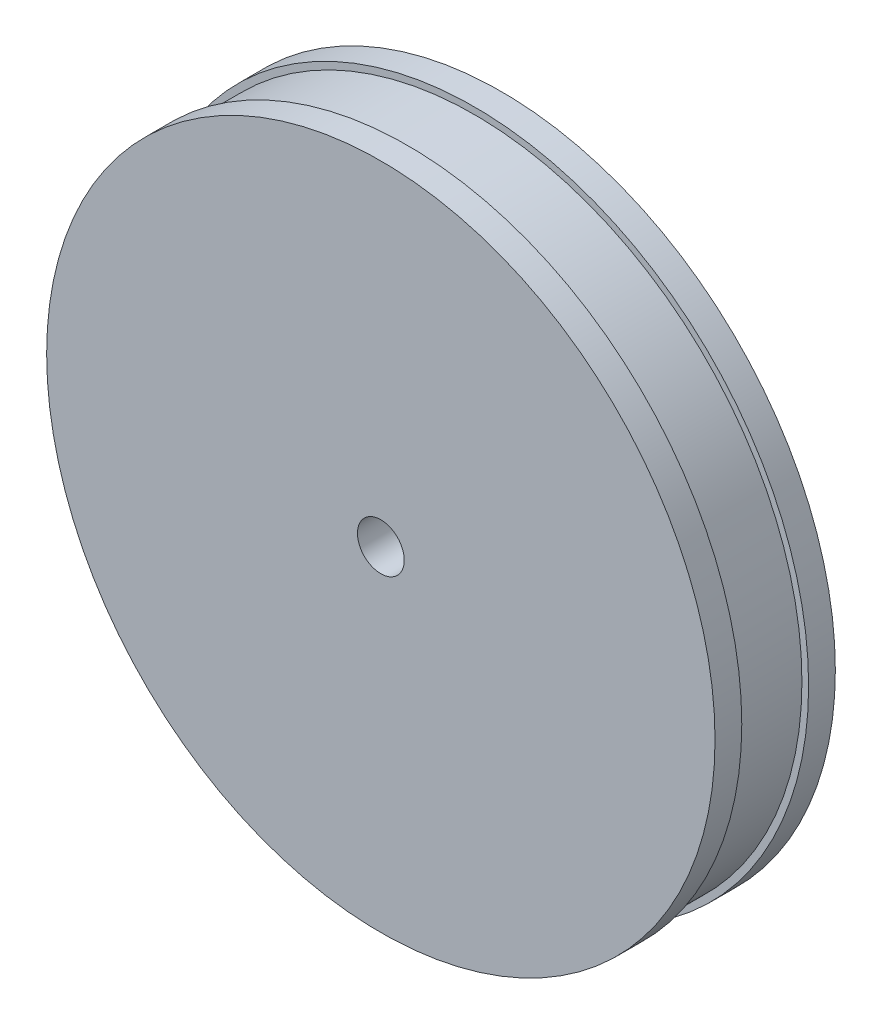
ISO-10303-21;
HEADER;
FILE_DESCRIPTION(('STEP AP214'),'2;1');
FILE_NAME('part.step','',(''),(''),'','','');
FILE_SCHEMA(('AUTOMOTIVE_DESIGN { 1 0 10303 214 1 1 1 1 }'));
ENDSEC;
DATA;
#1=APPLICATION_CONTEXT('core data for automotive mechanical design processes');
#2=APPLICATION_PROTOCOL_DEFINITION('international standard','automotive_design',2000,#1);
#3=PRODUCT_CONTEXT('',#1,'mechanical');
#4=PRODUCT('Part','Part','',(#3));
#5=PRODUCT_RELATED_PRODUCT_CATEGORY('part','',(#4));
#6=PRODUCT_DEFINITION_FORMATION('','',#4);
#7=PRODUCT_DEFINITION_CONTEXT('part definition',#1,'design');
#8=PRODUCT_DEFINITION('design','',#6,#7);
#9=PRODUCT_DEFINITION_SHAPE('','',#8);
#10=(LENGTH_UNIT() NAMED_UNIT(*) SI_UNIT(.MILLI.,.METRE.));
#11=(NAMED_UNIT(*) PLANE_ANGLE_UNIT() SI_UNIT($,.RADIAN.));
#12=(NAMED_UNIT(*) SI_UNIT($,.STERADIAN.) SOLID_ANGLE_UNIT());
#13=UNCERTAINTY_MEASURE_WITH_UNIT(LENGTH_MEASURE(1.E-05),#10,'distance_accuracy_value','');
#14=(GEOMETRIC_REPRESENTATION_CONTEXT(3) GLOBAL_UNCERTAINTY_ASSIGNED_CONTEXT((#13)) GLOBAL_UNIT_ASSIGNED_CONTEXT((#10,
#11,#12)) REPRESENTATION_CONTEXT('',''));
#15=CARTESIAN_POINT('',(0.,0.,0.));
#16=DIRECTION('',(0.,0.,1.));
#17=DIRECTION('',(1.,0.,0.));
#18=AXIS2_PLACEMENT_3D('',#15,#16,#17);
#19=CARTESIAN_POINT('',(0.,0.,5.));
#20=DIRECTION('',(0.,0.,-1.));
#21=DIRECTION('',(-1.,0.,0.));
#22=AXIS2_PLACEMENT_3D('',#19,#20,#21);
#23=CYLINDRICAL_SURFACE('',#22,24.5);
#24=CARTESIAN_POINT('',(0.,0.,5.));
#25=DIRECTION('',(0.,0.,1.));
#26=DIRECTION('',(1.,0.,0.));
#27=AXIS2_PLACEMENT_3D('',#24,#25,#26);
#28=CIRCLE('',#27,24.5);
#29=CARTESIAN_POINT('',(24.5,0.,5.));
#30=VERTEX_POINT('',#29);
#31=EDGE_CURVE('E10',#30,#30,#28,.T.);
#32=ORIENTED_EDGE('',*,*,#31,.F.);
#33=EDGE_LOOP('',(#32));
#34=FACE_BOUND('',#33,.T.);
#35=CARTESIAN_POINT('',(0.,0.,0.));
#36=DIRECTION('',(0.,0.,1.));
#37=DIRECTION('',(1.,0.,0.));
#38=AXIS2_PLACEMENT_3D('',#35,#36,#37);
#39=CIRCLE('',#38,24.5);
#40=CARTESIAN_POINT('',(24.5,0.,0.));
#41=VERTEX_POINT('',#40);
#42=EDGE_CURVE('E33',#41,#41,#39,.T.);
#43=ORIENTED_EDGE('',*,*,#42,.T.);
#44=EDGE_LOOP('',(#43));
#45=FACE_BOUND('',#44,.T.);
#46=ADVANCED_FACE('F30',(#34,#45),#23,.T.);
#47=CARTESIAN_POINT('',(0.,0.,-2.));
#48=DIRECTION('',(0.,0.,1.));
#49=DIRECTION('',(1.,0.,0.));
#50=AXIS2_PLACEMENT_3D('',#47,#48,#49);
#51=CYLINDRICAL_SURFACE('',#50,25.);
#52=CARTESIAN_POINT('',(0.,0.,-2.));
#53=DIRECTION('',(0.,0.,-1.));
#54=DIRECTION('',(-1.,0.,0.));
#55=AXIS2_PLACEMENT_3D('',#52,#53,#54);
#56=CIRCLE('',#55,25.);
#57=CARTESIAN_POINT('',(-25.,0.,-2.));
#58=VERTEX_POINT('',#57);
#59=EDGE_CURVE('E40',#58,#58,#56,.T.);
#60=ORIENTED_EDGE('',*,*,#59,.F.);
#61=EDGE_LOOP('',(#60));
#62=FACE_BOUND('',#61,.T.);
#63=CARTESIAN_POINT('',(0.,0.,0.));
#64=DIRECTION('',(0.,0.,-1.));
#65=DIRECTION('',(-1.,0.,0.));
#66=AXIS2_PLACEMENT_3D('',#63,#64,#65);
#67=CIRCLE('',#66,25.);
#68=CARTESIAN_POINT('',(-25.,0.,0.));
#69=VERTEX_POINT('',#68);
#70=EDGE_CURVE('E42',#69,#69,#67,.T.);
#71=ORIENTED_EDGE('',*,*,#70,.T.);
#72=EDGE_LOOP('',(#71));
#73=FACE_BOUND('',#72,.T.);
#74=ADVANCED_FACE('F74',(#62,#73),#51,.T.);
#75=CARTESIAN_POINT('',(0.,0.,-2.));
#76=DIRECTION('',(0.,0.,-1.));
#77=DIRECTION('',(-1.,0.,0.));
#78=AXIS2_PLACEMENT_3D('',#75,#76,#77);
#79=PLANE('',#78);
#80=CARTESIAN_POINT('',(0.,0.,-2.));
#81=DIRECTION('',(0.,0.,-1.));
#82=DIRECTION('',(-1.,0.,0.));
#83=AXIS2_PLACEMENT_3D('',#80,#81,#82);
#84=CIRCLE('',#83,1.75);
#85=CARTESIAN_POINT('',(-1.75,0.,-2.));
#86=VERTEX_POINT('',#85);
#87=EDGE_CURVE('E54',#86,#86,#84,.T.);
#88=ORIENTED_EDGE('',*,*,#87,.F.);
#89=EDGE_LOOP('',(#88));
#90=FACE_BOUND('',#89,.T.);
#91=ORIENTED_EDGE('',*,*,#59,.T.);
#92=EDGE_LOOP('',(#91));
#93=FACE_BOUND('',#92,.T.);
#94=ADVANCED_FACE('F70',(#90,#93),#79,.T.);
#95=CARTESIAN_POINT('',(0.,0.,0.));
#96=DIRECTION('',(0.,0.,-1.));
#97=DIRECTION('',(-1.,0.,0.));
#98=AXIS2_PLACEMENT_3D('',#95,#96,#97);
#99=PLANE('',#98);
#100=ORIENTED_EDGE('',*,*,#42,.F.);
#101=EDGE_LOOP('',(#100));
#102=FACE_BOUND('',#101,.T.);
#103=ORIENTED_EDGE('',*,*,#70,.F.);
#104=EDGE_LOOP('',(#103));
#105=FACE_BOUND('',#104,.T.);
#106=ADVANCED_FACE('F73',(#102,#105),#99,.F.);
#107=CARTESIAN_POINT('',(0.,0.,7.));
#108=DIRECTION('',(0.,0.,-1.));
#109=DIRECTION('',(-1.,0.,0.));
#110=AXIS2_PLACEMENT_3D('',#107,#108,#109);
#111=CYLINDRICAL_SURFACE('',#110,25.);
#112=CARTESIAN_POINT('',(0.,0.,7.));
#113=DIRECTION('',(0.,0.,1.));
#114=DIRECTION('',(1.,0.,0.));
#115=AXIS2_PLACEMENT_3D('',#112,#113,#114);
#116=CIRCLE('',#115,25.);
#117=CARTESIAN_POINT('',(25.,0.,7.));
#118=VERTEX_POINT('',#117);
#119=EDGE_CURVE('E45',#118,#118,#116,.T.);
#120=ORIENTED_EDGE('',*,*,#119,.F.);
#121=EDGE_LOOP('',(#120));
#122=FACE_BOUND('',#121,.T.);
#123=CARTESIAN_POINT('',(0.,0.,5.));
#124=DIRECTION('',(0.,0.,1.));
#125=DIRECTION('',(1.,0.,0.));
#126=AXIS2_PLACEMENT_3D('',#123,#124,#125);
#127=CIRCLE('',#126,25.);
#128=CARTESIAN_POINT('',(25.,0.,5.));
#129=VERTEX_POINT('',#128);
#130=EDGE_CURVE('E48',#129,#129,#127,.T.);
#131=ORIENTED_EDGE('',*,*,#130,.T.);
#132=EDGE_LOOP('',(#131));
#133=FACE_BOUND('',#132,.T.);
#134=ADVANCED_FACE('F83',(#122,#133),#111,.T.);
#135=CARTESIAN_POINT('',(0.,0.,7.));
#136=DIRECTION('',(0.,0.,1.));
#137=DIRECTION('',(1.,0.,0.));
#138=AXIS2_PLACEMENT_3D('',#135,#136,#137);
#139=PLANE('',#138);
#140=CARTESIAN_POINT('',(0.,0.,7.));
#141=DIRECTION('',(0.,0.,-1.));
#142=DIRECTION('',(-1.,0.,0.));
#143=AXIS2_PLACEMENT_3D('',#140,#141,#142);
#144=CIRCLE('',#143,1.75);
#145=CARTESIAN_POINT('',(-1.75,0.,7.));
#146=VERTEX_POINT('',#145);
#147=EDGE_CURVE('E51',#146,#146,#144,.T.);
#148=ORIENTED_EDGE('',*,*,#147,.T.);
#149=EDGE_LOOP('',(#148));
#150=FACE_BOUND('',#149,.T.);
#151=ORIENTED_EDGE('',*,*,#119,.T.);
#152=EDGE_LOOP('',(#151));
#153=FACE_BOUND('',#152,.T.);
#154=ADVANCED_FACE('F60',(#150,#153),#139,.T.);
#155=CARTESIAN_POINT('',(0.,0.,5.));
#156=DIRECTION('',(0.,0.,1.));
#157=DIRECTION('',(1.,0.,0.));
#158=AXIS2_PLACEMENT_3D('',#155,#156,#157);
#159=PLANE('',#158);
#160=ORIENTED_EDGE('',*,*,#31,.T.);
#161=EDGE_LOOP('',(#160));
#162=FACE_BOUND('',#161,.T.);
#163=ORIENTED_EDGE('',*,*,#130,.F.);
#164=EDGE_LOOP('',(#163));
#165=FACE_BOUND('',#164,.T.);
#166=ADVANCED_FACE('F66',(#162,#165),#159,.F.);
#167=CARTESIAN_POINT('',(0.,0.,7.));
#168=DIRECTION('',(0.,0.,-1.));
#169=DIRECTION('',(-1.,0.,0.));
#170=AXIS2_PLACEMENT_3D('',#167,#168,#169);
#171=CYLINDRICAL_SURFACE('',#170,1.75);
#172=ORIENTED_EDGE('',*,*,#147,.F.);
#173=EDGE_LOOP('',(#172));
#174=FACE_BOUND('',#173,.T.);
#175=ORIENTED_EDGE('',*,*,#87,.T.);
#176=EDGE_LOOP('',(#175));
#177=FACE_BOUND('',#176,.T.);
#178=ADVANCED_FACE('F63',(#174,#177),#171,.F.);
#179=CLOSED_SHELL('',(#46,#74,#94,#106,#134,#154,#166,#178));
#180=MANIFOLD_SOLID_BREP('B2',#179);
#181=ADVANCED_BREP_SHAPE_REPRESENTATION('',(#18,#180),#14);
#182=SHAPE_DEFINITION_REPRESENTATION(#9,#181);
ENDSEC;
END-ISO-10303-21;
